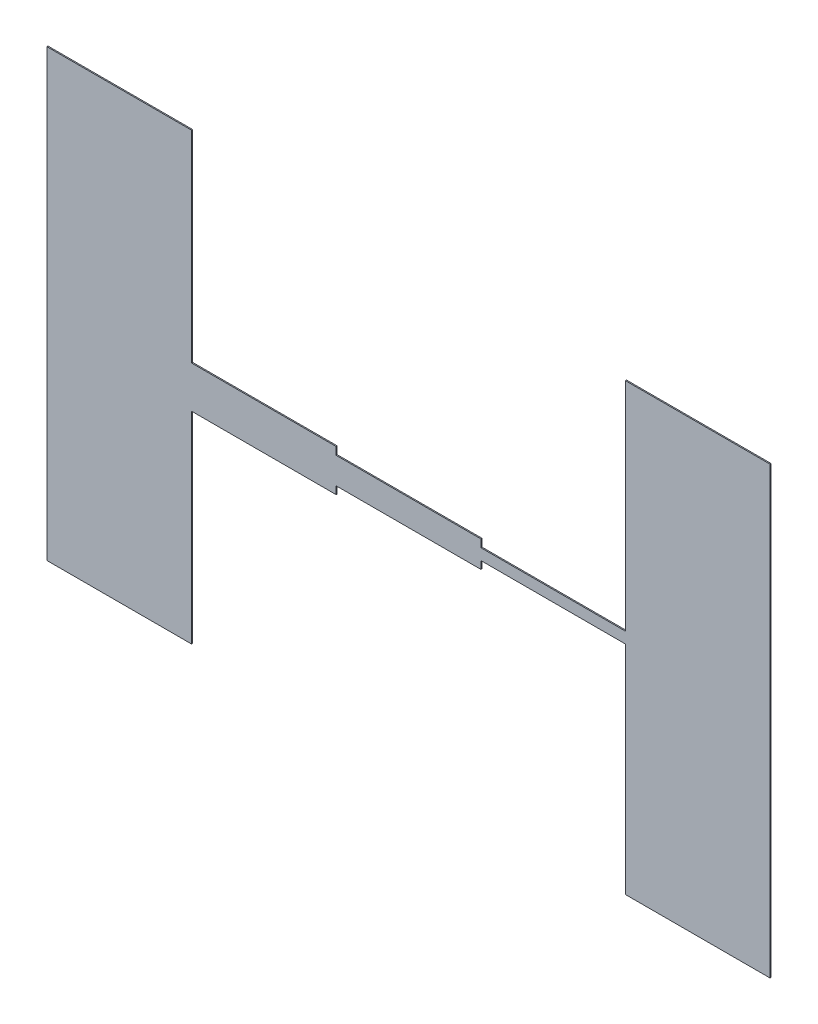
ISO-10303-21;
HEADER;
FILE_DESCRIPTION(('STEP AP214'),'2;1');
FILE_NAME('part.step','',(''),(''),'','','');
FILE_SCHEMA(('AUTOMOTIVE_DESIGN { 1 0 10303 214 1 1 1 1 }'));
ENDSEC;
DATA;
#1=APPLICATION_CONTEXT('core data for automotive mechanical design processes');
#2=APPLICATION_PROTOCOL_DEFINITION('international standard','automotive_design',2000,#1);
#3=PRODUCT_CONTEXT('',#1,'mechanical');
#4=PRODUCT('Part','Part','',(#3));
#5=PRODUCT_RELATED_PRODUCT_CATEGORY('part','',(#4));
#6=PRODUCT_DEFINITION_FORMATION('','',#4);
#7=PRODUCT_DEFINITION_CONTEXT('part definition',#1,'design');
#8=PRODUCT_DEFINITION('design','',#6,#7);
#9=PRODUCT_DEFINITION_SHAPE('','',#8);
#10=(LENGTH_UNIT() NAMED_UNIT(*) SI_UNIT(.MILLI.,.METRE.));
#11=(NAMED_UNIT(*) PLANE_ANGLE_UNIT() SI_UNIT($,.RADIAN.));
#12=(NAMED_UNIT(*) SI_UNIT($,.STERADIAN.) SOLID_ANGLE_UNIT());
#13=UNCERTAINTY_MEASURE_WITH_UNIT(LENGTH_MEASURE(1.E-05),#10,'distance_accuracy_value','');
#14=(GEOMETRIC_REPRESENTATION_CONTEXT(3) GLOBAL_UNCERTAINTY_ASSIGNED_CONTEXT((#13)) GLOBAL_UNIT_ASSIGNED_CONTEXT((#10,
#11,#12)) REPRESENTATION_CONTEXT('',''));
#15=CARTESIAN_POINT('',(0.,0.,0.));
#16=DIRECTION('',(0.,0.,1.));
#17=DIRECTION('',(1.,0.,0.));
#18=AXIS2_PLACEMENT_3D('',#15,#16,#17);
#19=CARTESIAN_POINT('',(4550.,0.,10.));
#20=DIRECTION('',(-1.,0.,0.));
#21=DIRECTION('',(0.,0.,1.));
#22=AXIS2_PLACEMENT_3D('',#19,#20,#21);
#23=PLANE('',#22);
#24=DIRECTION('',(0.,1.,0.));
#25=VECTOR('',#24,1.);
#26=CARTESIAN_POINT('',(4550.,0.,0.));
#27=LINE('',#26,#25);
#28=CARTESIAN_POINT('',(4550.,-2000.,0.));
#29=VERTEX_POINT('',#28);
#30=CARTESIAN_POINT('',(4550.,-49.9999999999999,0.));
#31=VERTEX_POINT('',#30);
#32=EDGE_CURVE('E220',#29,#31,#27,.T.);
#33=ORIENTED_EDGE('',*,*,#32,.F.);
#34=DIRECTION('',(0.,0.,-1.));
#35=VECTOR('',#34,1.);
#36=CARTESIAN_POINT('',(4550.,-2000.,10.));
#37=LINE('',#36,#35);
#38=CARTESIAN_POINT('',(4550.,-2000.,10.));
#39=VERTEX_POINT('',#38);
#40=EDGE_CURVE('E11',#39,#29,#37,.T.);
#41=ORIENTED_EDGE('',*,*,#40,.F.);
#42=DIRECTION('',(0.,1.,0.));
#43=VECTOR('',#42,1.);
#44=CARTESIAN_POINT('',(4550.,0.,10.));
#45=LINE('',#44,#43);
#46=CARTESIAN_POINT('',(4550.,-49.9999999999999,10.));
#47=VERTEX_POINT('',#46);
#48=EDGE_CURVE('E289',#39,#47,#45,.T.);
#49=ORIENTED_EDGE('',*,*,#48,.T.);
#50=DIRECTION('',(0.,0.,-1.));
#51=VECTOR('',#50,1.);
#52=CARTESIAN_POINT('',(4550.,-49.9999999999999,10.));
#53=LINE('',#52,#51);
#54=EDGE_CURVE('E64',#47,#31,#53,.T.);
#55=ORIENTED_EDGE('',*,*,#54,.T.);
#56=EDGE_LOOP('',(#33,#41,#49,#55));
#57=FACE_BOUND('',#56,.T.);
#58=ADVANCED_FACE('F47',(#57),#23,.T.);
#59=CARTESIAN_POINT('',(3.41607084500048E-13,-2000.,10.));
#60=DIRECTION('',(0.,-1.,0.));
#61=DIRECTION('',(1.,0.,0.));
#62=AXIS2_PLACEMENT_3D('',#59,#60,#61);
#63=PLANE('',#62);
#64=DIRECTION('',(-1.,0.,0.));
#65=VECTOR('',#64,1.);
#66=CARTESIAN_POINT('',(3.41607084500048E-13,-2000.,0.));
#67=LINE('',#66,#65);
#68=CARTESIAN_POINT('',(5850.,-2000.,0.));
#69=VERTEX_POINT('',#68);
#70=EDGE_CURVE('E223',#69,#29,#67,.T.);
#71=ORIENTED_EDGE('',*,*,#70,.F.);
#72=DIRECTION('',(0.,0.,-1.));
#73=VECTOR('',#72,1.);
#74=CARTESIAN_POINT('',(5850.,-2000.,10.));
#75=LINE('',#74,#73);
#76=CARTESIAN_POINT('',(5850.,-2000.,10.));
#77=VERTEX_POINT('',#76);
#78=EDGE_CURVE('E56',#77,#69,#75,.T.);
#79=ORIENTED_EDGE('',*,*,#78,.F.);
#80=DIRECTION('',(-1.,0.,0.));
#81=VECTOR('',#80,1.);
#82=CARTESIAN_POINT('',(3.41607084500048E-13,-2000.,10.));
#83=LINE('',#82,#81);
#84=EDGE_CURVE('E359',#77,#39,#83,.T.);
#85=ORIENTED_EDGE('',*,*,#84,.T.);
#86=ORIENTED_EDGE('',*,*,#40,.T.);
#87=EDGE_LOOP('',(#71,#79,#85,#86));
#88=FACE_BOUND('',#87,.T.);
#89=ADVANCED_FACE('F358',(#88),#63,.T.);
#90=CARTESIAN_POINT('',(5850.,0.,10.));
#91=DIRECTION('',(-1.,0.,0.));
#92=DIRECTION('',(0.,0.,1.));
#93=AXIS2_PLACEMENT_3D('',#90,#91,#92);
#94=PLANE('',#93);
#95=DIRECTION('',(0.,1.,0.));
#96=VECTOR('',#95,1.);
#97=CARTESIAN_POINT('',(5850.,0.,0.));
#98=LINE('',#97,#96);
#99=CARTESIAN_POINT('',(5850.,2000.,0.));
#100=VERTEX_POINT('',#99);
#101=EDGE_CURVE('E227',#69,#100,#98,.T.);
#102=ORIENTED_EDGE('',*,*,#101,.T.);
#103=DIRECTION('',(0.,0.,-1.));
#104=VECTOR('',#103,1.);
#105=CARTESIAN_POINT('',(5850.,2000.,10.));
#106=LINE('',#105,#104);
#107=CARTESIAN_POINT('',(5850.,2000.,10.));
#108=VERTEX_POINT('',#107);
#109=EDGE_CURVE('E341',#108,#100,#106,.T.);
#110=ORIENTED_EDGE('',*,*,#109,.F.);
#111=DIRECTION('',(0.,1.,0.));
#112=VECTOR('',#111,1.);
#113=CARTESIAN_POINT('',(5850.,0.,10.));
#114=LINE('',#113,#112);
#115=EDGE_CURVE('E350',#77,#108,#114,.T.);
#116=ORIENTED_EDGE('',*,*,#115,.F.);
#117=ORIENTED_EDGE('',*,*,#78,.T.);
#118=EDGE_LOOP('',(#102,#110,#116,#117));
#119=FACE_BOUND('',#118,.T.);
#120=ADVANCED_FACE('F348',(#119),#94,.F.);
#121=CARTESIAN_POINT('',(0.,2000.,10.));
#122=DIRECTION('',(0.,-1.,0.));
#123=DIRECTION('',(0.,0.,-1.));
#124=AXIS2_PLACEMENT_3D('',#121,#122,#123);
#125=PLANE('',#124);
#126=DIRECTION('',(-1.,0.,0.));
#127=VECTOR('',#126,1.);
#128=CARTESIAN_POINT('',(0.,2000.,0.));
#129=LINE('',#128,#127);
#130=CARTESIAN_POINT('',(4550.,2000.,0.));
#131=VERTEX_POINT('',#130);
#132=EDGE_CURVE('E230',#100,#131,#129,.T.);
#133=ORIENTED_EDGE('',*,*,#132,.T.);
#134=DIRECTION('',(0.,0.,-1.));
#135=VECTOR('',#134,1.);
#136=CARTESIAN_POINT('',(4550.,2000.,10.));
#137=LINE('',#136,#135);
#138=CARTESIAN_POINT('',(4550.,2000.,10.));
#139=VERTEX_POINT('',#138);
#140=EDGE_CURVE('E338',#139,#131,#137,.T.);
#141=ORIENTED_EDGE('',*,*,#140,.F.);
#142=DIRECTION('',(-1.,0.,0.));
#143=VECTOR('',#142,1.);
#144=CARTESIAN_POINT('',(0.,2000.,10.));
#145=LINE('',#144,#143);
#146=EDGE_CURVE('E609',#108,#139,#145,.T.);
#147=ORIENTED_EDGE('',*,*,#146,.F.);
#148=ORIENTED_EDGE('',*,*,#109,.T.);
#149=EDGE_LOOP('',(#133,#141,#147,#148));
#150=FACE_BOUND('',#149,.T.);
#151=ADVANCED_FACE('F377',(#150),#125,.F.);
#152=CARTESIAN_POINT('',(4550.,0.,10.));
#153=DIRECTION('',(-1.,0.,0.));
#154=DIRECTION('',(0.,0.,1.));
#155=AXIS2_PLACEMENT_3D('',#152,#153,#154);
#156=PLANE('',#155);
#157=DIRECTION('',(0.,1.,0.));
#158=VECTOR('',#157,1.);
#159=CARTESIAN_POINT('',(4550.,0.,0.));
#160=LINE('',#159,#158);
#161=CARTESIAN_POINT('',(4550.,50.0000000000001,0.));
#162=VERTEX_POINT('',#161);
#163=EDGE_CURVE('E234',#162,#131,#160,.T.);
#164=ORIENTED_EDGE('',*,*,#163,.F.);
#165=DIRECTION('',(0.,0.,-1.));
#166=VECTOR('',#165,1.);
#167=CARTESIAN_POINT('',(4550.,50.0000000000001,10.));
#168=LINE('',#167,#166);
#169=CARTESIAN_POINT('',(4550.,50.0000000000001,10.));
#170=VERTEX_POINT('',#169);
#171=EDGE_CURVE('E335',#170,#162,#168,.T.);
#172=ORIENTED_EDGE('',*,*,#171,.F.);
#173=DIRECTION('',(0.,1.,0.));
#174=VECTOR('',#173,1.);
#175=CARTESIAN_POINT('',(4550.,0.,10.));
#176=LINE('',#175,#174);
#177=EDGE_CURVE('E607',#170,#139,#176,.T.);
#178=ORIENTED_EDGE('',*,*,#177,.T.);
#179=ORIENTED_EDGE('',*,*,#140,.T.);
#180=EDGE_LOOP('',(#164,#172,#178,#179));
#181=FACE_BOUND('',#180,.T.);
#182=ADVANCED_FACE('F382',(#181),#156,.T.);
#183=CARTESIAN_POINT('',(0.,49.9999999999995,10.));
#184=DIRECTION('',(0.,-1.,0.));
#185=DIRECTION('',(1.,0.,0.));
#186=AXIS2_PLACEMENT_3D('',#183,#184,#185);
#187=PLANE('',#186);
#188=DIRECTION('',(-1.,0.,0.));
#189=VECTOR('',#188,1.);
#190=CARTESIAN_POINT('',(0.,49.9999999999995,0.));
#191=LINE('',#190,#189);
#192=CARTESIAN_POINT('',(3250.,49.9999999999999,0.));
#193=VERTEX_POINT('',#192);
#194=EDGE_CURVE('E238',#162,#193,#191,.T.);
#195=ORIENTED_EDGE('',*,*,#194,.T.);
#196=DIRECTION('',(0.,0.,-1.));
#197=VECTOR('',#196,1.);
#198=CARTESIAN_POINT('',(3250.,49.9999999999999,10.));
#199=LINE('',#198,#197);
#200=CARTESIAN_POINT('',(3250.,49.9999999999999,10.));
#201=VERTEX_POINT('',#200);
#202=EDGE_CURVE('E331',#201,#193,#199,.T.);
#203=ORIENTED_EDGE('',*,*,#202,.F.);
#204=DIRECTION('',(-1.,0.,0.));
#205=VECTOR('',#204,1.);
#206=CARTESIAN_POINT('',(0.,49.9999999999995,10.));
#207=LINE('',#206,#205);
#208=EDGE_CURVE('E602',#170,#201,#207,.T.);
#209=ORIENTED_EDGE('',*,*,#208,.F.);
#210=ORIENTED_EDGE('',*,*,#171,.T.);
#211=EDGE_LOOP('',(#195,#203,#209,#210));
#212=FACE_BOUND('',#211,.T.);
#213=ADVANCED_FACE('F386',(#212),#187,.F.);
#214=CARTESIAN_POINT('',(3250.,0.,10.));
#215=DIRECTION('',(-1.,0.,0.));
#216=DIRECTION('',(0.,0.,1.));
#217=AXIS2_PLACEMENT_3D('',#214,#215,#216);
#218=PLANE('',#217);
#219=DIRECTION('',(0.,1.,0.));
#220=VECTOR('',#219,1.);
#221=CARTESIAN_POINT('',(3250.,0.,0.));
#222=LINE('',#221,#220);
#223=CARTESIAN_POINT('',(3250.,118.75,0.));
#224=VERTEX_POINT('',#223);
#225=EDGE_CURVE('E241',#193,#224,#222,.T.);
#226=ORIENTED_EDGE('',*,*,#225,.T.);
#227=DIRECTION('',(0.,0.,-1.));
#228=VECTOR('',#227,1.);
#229=CARTESIAN_POINT('',(3250.,118.75,10.));
#230=LINE('',#229,#228);
#231=CARTESIAN_POINT('',(3250.,118.75,10.));
#232=VERTEX_POINT('',#231);
#233=EDGE_CURVE('E327',#232,#224,#230,.T.);
#234=ORIENTED_EDGE('',*,*,#233,.F.);
#235=DIRECTION('',(0.,1.,0.));
#236=VECTOR('',#235,1.);
#237=CARTESIAN_POINT('',(3250.,0.,10.));
#238=LINE('',#237,#236);
#239=EDGE_CURVE('E599',#201,#232,#238,.T.);
#240=ORIENTED_EDGE('',*,*,#239,.F.);
#241=ORIENTED_EDGE('',*,*,#202,.T.);
#242=EDGE_LOOP('',(#226,#234,#240,#241));
#243=FACE_BOUND('',#242,.T.);
#244=ADVANCED_FACE('F390',(#243),#218,.F.);
#245=CARTESIAN_POINT('',(0.,118.75,10.));
#246=DIRECTION('',(0.,-1.,0.));
#247=DIRECTION('',(1.,0.,0.));
#248=AXIS2_PLACEMENT_3D('',#245,#246,#247);
#249=PLANE('',#248);
#250=DIRECTION('',(-1.,0.,0.));
#251=VECTOR('',#250,1.);
#252=CARTESIAN_POINT('',(0.,118.75,0.));
#253=LINE('',#252,#251);
#254=CARTESIAN_POINT('',(1950.,118.75,0.));
#255=VERTEX_POINT('',#254);
#256=EDGE_CURVE('E244',#224,#255,#253,.T.);
#257=ORIENTED_EDGE('',*,*,#256,.T.);
#258=DIRECTION('',(0.,0.,-1.));
#259=VECTOR('',#258,1.);
#260=CARTESIAN_POINT('',(1950.,118.75,10.));
#261=LINE('',#260,#259);
#262=CARTESIAN_POINT('',(1950.,118.75,10.));
#263=VERTEX_POINT('',#262);
#264=EDGE_CURVE('E323',#263,#255,#261,.T.);
#265=ORIENTED_EDGE('',*,*,#264,.F.);
#266=DIRECTION('',(-1.,0.,0.));
#267=VECTOR('',#266,1.);
#268=CARTESIAN_POINT('',(0.,118.75,10.));
#269=LINE('',#268,#267);
#270=EDGE_CURVE('E597',#232,#263,#269,.T.);
#271=ORIENTED_EDGE('',*,*,#270,.F.);
#272=ORIENTED_EDGE('',*,*,#233,.T.);
#273=EDGE_LOOP('',(#257,#265,#271,#272));
#274=FACE_BOUND('',#273,.T.);
#275=ADVANCED_FACE('F394',(#274),#249,.F.);
#276=CARTESIAN_POINT('',(1950.,0.,10.));
#277=DIRECTION('',(-1.,0.,0.));
#278=DIRECTION('',(0.,0.,1.));
#279=AXIS2_PLACEMENT_3D('',#276,#277,#278);
#280=PLANE('',#279);
#281=DIRECTION('',(0.,1.,0.));
#282=VECTOR('',#281,1.);
#283=CARTESIAN_POINT('',(1950.,0.,0.));
#284=LINE('',#283,#282);
#285=CARTESIAN_POINT('',(1950.,187.5,0.));
#286=VERTEX_POINT('',#285);
#287=EDGE_CURVE('E247',#255,#286,#284,.T.);
#288=ORIENTED_EDGE('',*,*,#287,.T.);
#289=DIRECTION('',(0.,0.,-1.));
#290=VECTOR('',#289,1.);
#291=CARTESIAN_POINT('',(1950.,187.5,10.));
#292=LINE('',#291,#290);
#293=CARTESIAN_POINT('',(1950.,187.5,10.));
#294=VERTEX_POINT('',#293);
#295=EDGE_CURVE('E319',#294,#286,#292,.T.);
#296=ORIENTED_EDGE('',*,*,#295,.F.);
#297=DIRECTION('',(0.,1.,0.));
#298=VECTOR('',#297,1.);
#299=CARTESIAN_POINT('',(1950.,0.,10.));
#300=LINE('',#299,#298);
#301=EDGE_CURVE('E590',#263,#294,#300,.T.);
#302=ORIENTED_EDGE('',*,*,#301,.F.);
#303=ORIENTED_EDGE('',*,*,#264,.T.);
#304=EDGE_LOOP('',(#288,#296,#302,#303));
#305=FACE_BOUND('',#304,.T.);
#306=ADVANCED_FACE('F398',(#305),#280,.F.);
#307=CARTESIAN_POINT('',(0.,187.499999999999,10.));
#308=DIRECTION('',(0.,-1.,0.));
#309=DIRECTION('',(1.,0.,0.));
#310=AXIS2_PLACEMENT_3D('',#307,#308,#309);
#311=PLANE('',#310);
#312=DIRECTION('',(-1.,0.,0.));
#313=VECTOR('',#312,1.);
#314=CARTESIAN_POINT('',(0.,187.499999999999,0.));
#315=LINE('',#314,#313);
#316=CARTESIAN_POINT('',(650.,187.5,0.));
#317=VERTEX_POINT('',#316);
#318=EDGE_CURVE('E250',#286,#317,#315,.T.);
#319=ORIENTED_EDGE('',*,*,#318,.T.);
#320=DIRECTION('',(0.,0.,-1.));
#321=VECTOR('',#320,1.);
#322=CARTESIAN_POINT('',(650.,187.5,10.));
#323=LINE('',#322,#321);
#324=CARTESIAN_POINT('',(650.,187.5,10.));
#325=VERTEX_POINT('',#324);
#326=EDGE_CURVE('E315',#325,#317,#323,.T.);
#327=ORIENTED_EDGE('',*,*,#326,.F.);
#328=DIRECTION('',(-1.,0.,0.));
#329=VECTOR('',#328,1.);
#330=CARTESIAN_POINT('',(0.,187.499999999999,10.));
#331=LINE('',#330,#329);
#332=EDGE_CURVE('E587',#294,#325,#331,.T.);
#333=ORIENTED_EDGE('',*,*,#332,.F.);
#334=ORIENTED_EDGE('',*,*,#295,.T.);
#335=EDGE_LOOP('',(#319,#327,#333,#334));
#336=FACE_BOUND('',#335,.T.);
#337=ADVANCED_FACE('F402',(#336),#311,.F.);
#338=CARTESIAN_POINT('',(650.,0.,10.));
#339=DIRECTION('',(-1.,0.,0.));
#340=DIRECTION('',(0.,0.,1.));
#341=AXIS2_PLACEMENT_3D('',#338,#339,#340);
#342=PLANE('',#341);
#343=DIRECTION('',(0.,1.,0.));
#344=VECTOR('',#343,1.);
#345=CARTESIAN_POINT('',(650.,0.,0.));
#346=LINE('',#345,#344);
#347=CARTESIAN_POINT('',(650.,2000.,0.));
#348=VERTEX_POINT('',#347);
#349=EDGE_CURVE('E253',#317,#348,#346,.T.);
#350=ORIENTED_EDGE('',*,*,#349,.T.);
#351=DIRECTION('',(0.,0.,-1.));
#352=VECTOR('',#351,1.);
#353=CARTESIAN_POINT('',(650.,2000.,10.));
#354=LINE('',#353,#352);
#355=CARTESIAN_POINT('',(650.,2000.,10.));
#356=VERTEX_POINT('',#355);
#357=EDGE_CURVE('E312',#356,#348,#354,.T.);
#358=ORIENTED_EDGE('',*,*,#357,.F.);
#359=DIRECTION('',(0.,1.,0.));
#360=VECTOR('',#359,1.);
#361=CARTESIAN_POINT('',(650.,0.,10.));
#362=LINE('',#361,#360);
#363=EDGE_CURVE('E585',#325,#356,#362,.T.);
#364=ORIENTED_EDGE('',*,*,#363,.F.);
#365=ORIENTED_EDGE('',*,*,#326,.T.);
#366=EDGE_LOOP('',(#350,#358,#364,#365));
#367=FACE_BOUND('',#366,.T.);
#368=ADVANCED_FACE('F406',(#367),#342,.F.);
#369=CARTESIAN_POINT('',(0.,2000.,10.));
#370=DIRECTION('',(0.,1.,0.));
#371=DIRECTION('',(0.,0.,1.));
#372=AXIS2_PLACEMENT_3D('',#369,#370,#371);
#373=PLANE('',#372);
#374=DIRECTION('',(1.,0.,0.));
#375=VECTOR('',#374,1.);
#376=CARTESIAN_POINT('',(0.,2000.,0.));
#377=LINE('',#376,#375);
#378=CARTESIAN_POINT('',(-650.,2000.,0.));
#379=VERTEX_POINT('',#378);
#380=EDGE_CURVE('E257',#379,#348,#377,.T.);
#381=ORIENTED_EDGE('',*,*,#380,.F.);
#382=DIRECTION('',(0.,0.,-1.));
#383=VECTOR('',#382,1.);
#384=CARTESIAN_POINT('',(-650.,2000.,10.));
#385=LINE('',#384,#383);
#386=CARTESIAN_POINT('',(-650.,2000.,10.));
#387=VERTEX_POINT('',#386);
#388=EDGE_CURVE('E309',#387,#379,#385,.T.);
#389=ORIENTED_EDGE('',*,*,#388,.F.);
#390=DIRECTION('',(1.,0.,0.));
#391=VECTOR('',#390,1.);
#392=CARTESIAN_POINT('',(0.,2000.,10.));
#393=LINE('',#392,#391);
#394=EDGE_CURVE('E630',#387,#356,#393,.T.);
#395=ORIENTED_EDGE('',*,*,#394,.T.);
#396=ORIENTED_EDGE('',*,*,#357,.T.);
#397=EDGE_LOOP('',(#381,#389,#395,#396));
#398=FACE_BOUND('',#397,.T.);
#399=ADVANCED_FACE('F410',(#398),#373,.T.);
#400=CARTESIAN_POINT('',(-650.,0.,10.));
#401=DIRECTION('',(-1.,0.,0.));
#402=DIRECTION('',(0.,0.,1.));
#403=AXIS2_PLACEMENT_3D('',#400,#401,#402);
#404=PLANE('',#403);
#405=DIRECTION('',(0.,1.,0.));
#406=VECTOR('',#405,1.);
#407=CARTESIAN_POINT('',(-650.,0.,0.));
#408=LINE('',#407,#406);
#409=CARTESIAN_POINT('',(-650.,-2000.,0.));
#410=VERTEX_POINT('',#409);
#411=EDGE_CURVE('E261',#410,#379,#408,.T.);
#412=ORIENTED_EDGE('',*,*,#411,.F.);
#413=DIRECTION('',(0.,0.,-1.));
#414=VECTOR('',#413,1.);
#415=CARTESIAN_POINT('',(-650.,-2000.,10.));
#416=LINE('',#415,#414);
#417=CARTESIAN_POINT('',(-650.,-2000.,10.));
#418=VERTEX_POINT('',#417);
#419=EDGE_CURVE('E306',#418,#410,#416,.T.);
#420=ORIENTED_EDGE('',*,*,#419,.F.);
#421=DIRECTION('',(0.,1.,0.));
#422=VECTOR('',#421,1.);
#423=CARTESIAN_POINT('',(-650.,0.,10.));
#424=LINE('',#423,#422);
#425=EDGE_CURVE('E576',#418,#387,#424,.T.);
#426=ORIENTED_EDGE('',*,*,#425,.T.);
#427=ORIENTED_EDGE('',*,*,#388,.T.);
#428=EDGE_LOOP('',(#412,#420,#426,#427));
#429=FACE_BOUND('',#428,.T.);
#430=ADVANCED_FACE('F414',(#429),#404,.T.);
#431=CARTESIAN_POINT('',(0.,-2000.,10.));
#432=DIRECTION('',(0.,1.,0.));
#433=DIRECTION('',(0.,0.,1.));
#434=AXIS2_PLACEMENT_3D('',#431,#432,#433);
#435=PLANE('',#434);
#436=DIRECTION('',(1.,0.,0.));
#437=VECTOR('',#436,1.);
#438=CARTESIAN_POINT('',(0.,-2000.,0.));
#439=LINE('',#438,#437);
#440=CARTESIAN_POINT('',(650.,-2000.,0.));
#441=VERTEX_POINT('',#440);
#442=EDGE_CURVE('E265',#410,#441,#439,.T.);
#443=ORIENTED_EDGE('',*,*,#442,.T.);
#444=DIRECTION('',(0.,0.,-1.));
#445=VECTOR('',#444,1.);
#446=CARTESIAN_POINT('',(650.,-2000.,10.));
#447=LINE('',#446,#445);
#448=CARTESIAN_POINT('',(650.,-2000.,10.));
#449=VERTEX_POINT('',#448);
#450=EDGE_CURVE('E302',#449,#441,#447,.T.);
#451=ORIENTED_EDGE('',*,*,#450,.F.);
#452=DIRECTION('',(1.,0.,0.));
#453=VECTOR('',#452,1.);
#454=CARTESIAN_POINT('',(0.,-2000.,10.));
#455=LINE('',#454,#453);
#456=EDGE_CURVE('E635',#418,#449,#455,.T.);
#457=ORIENTED_EDGE('',*,*,#456,.F.);
#458=ORIENTED_EDGE('',*,*,#419,.T.);
#459=EDGE_LOOP('',(#443,#451,#457,#458));
#460=FACE_BOUND('',#459,.T.);
#461=ADVANCED_FACE('F418',(#460),#435,.F.);
#462=CARTESIAN_POINT('',(650.,0.,10.));
#463=DIRECTION('',(-1.,0.,0.));
#464=DIRECTION('',(0.,-1.,0.));
#465=AXIS2_PLACEMENT_3D('',#462,#463,#464);
#466=PLANE('',#465);
#467=DIRECTION('',(0.,1.,0.));
#468=VECTOR('',#467,1.);
#469=CARTESIAN_POINT('',(650.,0.,0.));
#470=LINE('',#469,#468);
#471=CARTESIAN_POINT('',(650.,-187.5,0.));
#472=VERTEX_POINT('',#471);
#473=EDGE_CURVE('E268',#441,#472,#470,.T.);
#474=ORIENTED_EDGE('',*,*,#473,.T.);
#475=DIRECTION('',(0.,0.,-1.));
#476=VECTOR('',#475,1.);
#477=CARTESIAN_POINT('',(650.,-187.5,10.));
#478=LINE('',#477,#476);
#479=CARTESIAN_POINT('',(650.,-187.5,10.));
#480=VERTEX_POINT('',#479);
#481=EDGE_CURVE('E299',#480,#472,#478,.T.);
#482=ORIENTED_EDGE('',*,*,#481,.F.);
#483=DIRECTION('',(0.,1.,0.));
#484=VECTOR('',#483,1.);
#485=CARTESIAN_POINT('',(650.,0.,10.));
#486=LINE('',#485,#484);
#487=EDGE_CURVE('E638',#449,#480,#486,.T.);
#488=ORIENTED_EDGE('',*,*,#487,.F.);
#489=ORIENTED_EDGE('',*,*,#450,.T.);
#490=EDGE_LOOP('',(#474,#482,#488,#489));
#491=FACE_BOUND('',#490,.T.);
#492=ADVANCED_FACE('F422',(#491),#466,.F.);
#493=CARTESIAN_POINT('',(0.,-187.500000000001,10.));
#494=DIRECTION('',(0.,-1.,0.));
#495=DIRECTION('',(1.,0.,0.));
#496=AXIS2_PLACEMENT_3D('',#493,#494,#495);
#497=PLANE('',#496);
#498=DIRECTION('',(-1.,0.,0.));
#499=VECTOR('',#498,1.);
#500=CARTESIAN_POINT('',(0.,-187.500000000001,0.));
#501=LINE('',#500,#499);
#502=CARTESIAN_POINT('',(1950.,-187.5,0.));
#503=VERTEX_POINT('',#502);
#504=EDGE_CURVE('E272',#503,#472,#501,.T.);
#505=ORIENTED_EDGE('',*,*,#504,.F.);
#506=DIRECTION('',(0.,0.,-1.));
#507=VECTOR('',#506,1.);
#508=CARTESIAN_POINT('',(1950.,-187.5,10.));
#509=LINE('',#508,#507);
#510=CARTESIAN_POINT('',(1950.,-187.5,10.));
#511=VERTEX_POINT('',#510);
#512=EDGE_CURVE('E296',#511,#503,#509,.T.);
#513=ORIENTED_EDGE('',*,*,#512,.F.);
#514=DIRECTION('',(-1.,0.,0.));
#515=VECTOR('',#514,1.);
#516=CARTESIAN_POINT('',(0.,-187.500000000001,10.));
#517=LINE('',#516,#515);
#518=EDGE_CURVE('E214',#511,#480,#517,.T.);
#519=ORIENTED_EDGE('',*,*,#518,.T.);
#520=ORIENTED_EDGE('',*,*,#481,.T.);
#521=EDGE_LOOP('',(#505,#513,#519,#520));
#522=FACE_BOUND('',#521,.T.);
#523=ADVANCED_FACE('F426',(#522),#497,.T.);
#524=CARTESIAN_POINT('',(1950.,0.,10.));
#525=DIRECTION('',(-1.,0.,0.));
#526=DIRECTION('',(0.,0.,1.));
#527=AXIS2_PLACEMENT_3D('',#524,#525,#526);
#528=PLANE('',#527);
#529=DIRECTION('',(0.,1.,0.));
#530=VECTOR('',#529,1.);
#531=CARTESIAN_POINT('',(1950.,0.,0.));
#532=LINE('',#531,#530);
#533=CARTESIAN_POINT('',(1950.,-118.75,0.));
#534=VERTEX_POINT('',#533);
#535=EDGE_CURVE('E276',#503,#534,#532,.T.);
#536=ORIENTED_EDGE('',*,*,#535,.T.);
#537=DIRECTION('',(0.,0.,-1.));
#538=VECTOR('',#537,1.);
#539=CARTESIAN_POINT('',(1950.,-118.75,10.));
#540=LINE('',#539,#538);
#541=CARTESIAN_POINT('',(1950.,-118.75,10.));
#542=VERTEX_POINT('',#541);
#543=EDGE_CURVE('E197',#542,#534,#540,.T.);
#544=ORIENTED_EDGE('',*,*,#543,.F.);
#545=DIRECTION('',(0.,1.,0.));
#546=VECTOR('',#545,1.);
#547=CARTESIAN_POINT('',(1950.,0.,10.));
#548=LINE('',#547,#546);
#549=EDGE_CURVE('E209',#511,#542,#548,.T.);
#550=ORIENTED_EDGE('',*,*,#549,.F.);
#551=ORIENTED_EDGE('',*,*,#512,.T.);
#552=EDGE_LOOP('',(#536,#544,#550,#551));
#553=FACE_BOUND('',#552,.T.);
#554=ADVANCED_FACE('F430',(#553),#528,.F.);
#555=CARTESIAN_POINT('',(0.,-118.75,10.));
#556=DIRECTION('',(0.,-1.,0.));
#557=DIRECTION('',(1.,0.,0.));
#558=AXIS2_PLACEMENT_3D('',#555,#556,#557);
#559=PLANE('',#558);
#560=DIRECTION('',(-1.,0.,0.));
#561=VECTOR('',#560,1.);
#562=CARTESIAN_POINT('',(0.,-118.75,0.));
#563=LINE('',#562,#561);
#564=CARTESIAN_POINT('',(3250.,-118.75,0.));
#565=VERTEX_POINT('',#564);
#566=EDGE_CURVE('E193',#565,#534,#563,.T.);
#567=ORIENTED_EDGE('',*,*,#566,.F.);
#568=DIRECTION('',(0.,0.,-1.));
#569=VECTOR('',#568,1.);
#570=CARTESIAN_POINT('',(3250.,-118.75,10.));
#571=LINE('',#570,#569);
#572=CARTESIAN_POINT('',(3250.,-118.75,10.));
#573=VERTEX_POINT('',#572);
#574=EDGE_CURVE('E187',#573,#565,#571,.T.);
#575=ORIENTED_EDGE('',*,*,#574,.F.);
#576=DIRECTION('',(-1.,0.,0.));
#577=VECTOR('',#576,1.);
#578=CARTESIAN_POINT('',(0.,-118.75,10.));
#579=LINE('',#578,#577);
#580=EDGE_CURVE('E191',#573,#542,#579,.T.);
#581=ORIENTED_EDGE('',*,*,#580,.T.);
#582=ORIENTED_EDGE('',*,*,#543,.T.);
#583=EDGE_LOOP('',(#567,#575,#581,#582));
#584=FACE_BOUND('',#583,.T.);
#585=ADVANCED_FACE('F189',(#584),#559,.T.);
#586=CARTESIAN_POINT('',(3250.,0.,10.));
#587=DIRECTION('',(-1.,0.,0.));
#588=DIRECTION('',(0.,0.,1.));
#589=AXIS2_PLACEMENT_3D('',#586,#587,#588);
#590=PLANE('',#589);
#591=DIRECTION('',(0.,1.,0.));
#592=VECTOR('',#591,1.);
#593=CARTESIAN_POINT('',(3250.,0.,0.));
#594=LINE('',#593,#592);
#595=CARTESIAN_POINT('',(3250.,-50.0000000000001,0.));
#596=VERTEX_POINT('',#595);
#597=EDGE_CURVE('E282',#565,#596,#594,.T.);
#598=ORIENTED_EDGE('',*,*,#597,.T.);
#599=DIRECTION('',(0.,0.,-1.));
#600=VECTOR('',#599,1.);
#601=CARTESIAN_POINT('',(3250.,-50.0000000000001,10.));
#602=LINE('',#601,#600);
#603=CARTESIAN_POINT('',(3250.,-50.0000000000001,10.));
#604=VERTEX_POINT('',#603);
#605=EDGE_CURVE('E126',#604,#596,#602,.T.);
#606=ORIENTED_EDGE('',*,*,#605,.F.);
#607=DIRECTION('',(0.,1.,0.));
#608=VECTOR('',#607,1.);
#609=CARTESIAN_POINT('',(3250.,0.,10.));
#610=LINE('',#609,#608);
#611=EDGE_CURVE('E199',#573,#604,#610,.T.);
#612=ORIENTED_EDGE('',*,*,#611,.F.);
#613=ORIENTED_EDGE('',*,*,#574,.T.);
#614=EDGE_LOOP('',(#598,#606,#612,#613));
#615=FACE_BOUND('',#614,.T.);
#616=ADVANCED_FACE('F200',(#615),#590,.F.);
#617=CARTESIAN_POINT('',(0.,-50.0000000000004,10.));
#618=DIRECTION('',(0.,-1.,0.));
#619=DIRECTION('',(1.,0.,0.));
#620=AXIS2_PLACEMENT_3D('',#617,#618,#619);
#621=PLANE('',#620);
#622=DIRECTION('',(-1.,0.,0.));
#623=VECTOR('',#622,1.);
#624=CARTESIAN_POINT('',(0.,-50.0000000000004,0.));
#625=LINE('',#624,#623);
#626=EDGE_CURVE('E285',#31,#596,#625,.T.);
#627=ORIENTED_EDGE('',*,*,#626,.F.);
#628=ORIENTED_EDGE('',*,*,#54,.F.);
#629=DIRECTION('',(-1.,0.,0.));
#630=VECTOR('',#629,1.);
#631=CARTESIAN_POINT('',(0.,-50.0000000000004,10.));
#632=LINE('',#631,#630);
#633=EDGE_CURVE('E204',#47,#604,#632,.T.);
#634=ORIENTED_EDGE('',*,*,#633,.T.);
#635=ORIENTED_EDGE('',*,*,#605,.T.);
#636=EDGE_LOOP('',(#627,#628,#634,#635));
#637=FACE_BOUND('',#636,.T.);
#638=ADVANCED_FACE('F360',(#637),#621,.T.);
#639=CARTESIAN_POINT('',(0.,0.,10.));
#640=DIRECTION('',(0.,0.,1.));
#641=DIRECTION('',(1.,0.,0.));
#642=AXIS2_PLACEMENT_3D('',#639,#640,#641);
#643=PLANE('',#642);
#644=ORIENTED_EDGE('',*,*,#48,.F.);
#645=ORIENTED_EDGE('',*,*,#84,.F.);
#646=ORIENTED_EDGE('',*,*,#115,.T.);
#647=ORIENTED_EDGE('',*,*,#146,.T.);
#648=ORIENTED_EDGE('',*,*,#177,.F.);
#649=ORIENTED_EDGE('',*,*,#208,.T.);
#650=ORIENTED_EDGE('',*,*,#239,.T.);
#651=ORIENTED_EDGE('',*,*,#270,.T.);
#652=ORIENTED_EDGE('',*,*,#301,.T.);
#653=ORIENTED_EDGE('',*,*,#332,.T.);
#654=ORIENTED_EDGE('',*,*,#363,.T.);
#655=ORIENTED_EDGE('',*,*,#394,.F.);
#656=ORIENTED_EDGE('',*,*,#425,.F.);
#657=ORIENTED_EDGE('',*,*,#456,.T.);
#658=ORIENTED_EDGE('',*,*,#487,.T.);
#659=ORIENTED_EDGE('',*,*,#518,.F.);
#660=ORIENTED_EDGE('',*,*,#549,.T.);
#661=ORIENTED_EDGE('',*,*,#580,.F.);
#662=ORIENTED_EDGE('',*,*,#611,.T.);
#663=ORIENTED_EDGE('',*,*,#633,.F.);
#664=EDGE_LOOP('',(#644,#645,#646,#647,#648,#649,#650,#651,#652,#653,#654,#655,#656,#657,#658,
#659,#660,#661,#662,#663));
#665=FACE_BOUND('',#664,.T.);
#666=ADVANCED_FACE('F206',(#665),#643,.T.);
#667=CARTESIAN_POINT('',(0.,0.,0.));
#668=DIRECTION('',(0.,0.,1.));
#669=DIRECTION('',(1.,0.,0.));
#670=AXIS2_PLACEMENT_3D('',#667,#668,#669);
#671=PLANE('',#670);
#672=ORIENTED_EDGE('',*,*,#32,.T.);
#673=ORIENTED_EDGE('',*,*,#626,.T.);
#674=ORIENTED_EDGE('',*,*,#597,.F.);
#675=ORIENTED_EDGE('',*,*,#566,.T.);
#676=ORIENTED_EDGE('',*,*,#535,.F.);
#677=ORIENTED_EDGE('',*,*,#504,.T.);
#678=ORIENTED_EDGE('',*,*,#473,.F.);
#679=ORIENTED_EDGE('',*,*,#442,.F.);
#680=ORIENTED_EDGE('',*,*,#411,.T.);
#681=ORIENTED_EDGE('',*,*,#380,.T.);
#682=ORIENTED_EDGE('',*,*,#349,.F.);
#683=ORIENTED_EDGE('',*,*,#318,.F.);
#684=ORIENTED_EDGE('',*,*,#287,.F.);
#685=ORIENTED_EDGE('',*,*,#256,.F.);
#686=ORIENTED_EDGE('',*,*,#225,.F.);
#687=ORIENTED_EDGE('',*,*,#194,.F.);
#688=ORIENTED_EDGE('',*,*,#163,.T.);
#689=ORIENTED_EDGE('',*,*,#132,.F.);
#690=ORIENTED_EDGE('',*,*,#101,.F.);
#691=ORIENTED_EDGE('',*,*,#70,.T.);
#692=EDGE_LOOP('',(#672,#673,#674,#675,#676,#677,#678,#679,#680,#681,#682,#683,#684,#685,#686,
#687,#688,#689,#690,#691));
#693=FACE_BOUND('',#692,.T.);
#694=ADVANCED_FACE('F357',(#693),#671,.F.);
#695=CLOSED_SHELL('',(#58,#89,#120,#151,#182,#213,#244,#275,#306,#337,#368,#399,#430,#461,#492,
#523,#554,#585,#616,#638,#666,#694));
#696=MANIFOLD_SOLID_BREP('B2',#695);
#697=ADVANCED_BREP_SHAPE_REPRESENTATION('',(#18,#696),#14);
#698=SHAPE_DEFINITION_REPRESENTATION(#9,#697);
ENDSEC;
END-ISO-10303-21;
